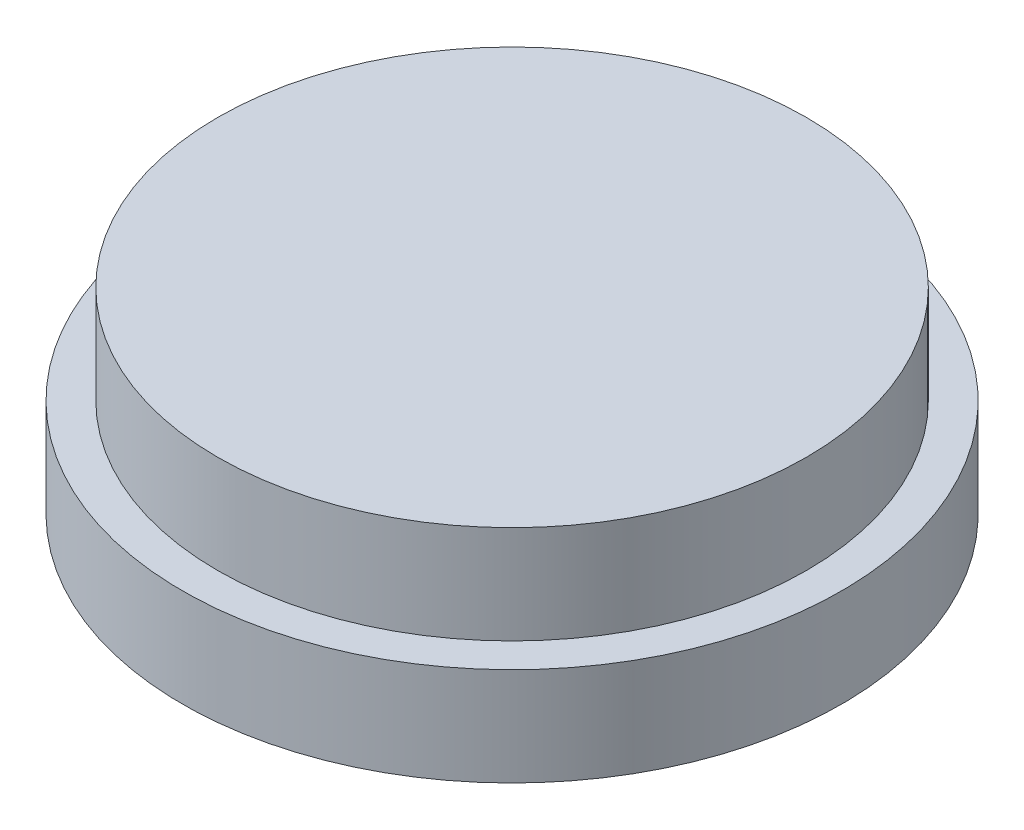
ISO-10303-21;
HEADER;
FILE_DESCRIPTION(('STEP AP214'),'2;1');
FILE_NAME('part.step','',(''),(''),'','','');
FILE_SCHEMA(('AUTOMOTIVE_DESIGN { 1 0 10303 214 1 1 1 1 }'));
ENDSEC;
DATA;
#1=APPLICATION_CONTEXT('core data for automotive mechanical design processes');
#2=APPLICATION_PROTOCOL_DEFINITION('international standard','automotive_design',2000,#1);
#3=PRODUCT_CONTEXT('',#1,'mechanical');
#4=PRODUCT('Part','Part','',(#3));
#5=PRODUCT_RELATED_PRODUCT_CATEGORY('part','',(#4));
#6=PRODUCT_DEFINITION_FORMATION('','',#4);
#7=PRODUCT_DEFINITION_CONTEXT('part definition',#1,'design');
#8=PRODUCT_DEFINITION('design','',#6,#7);
#9=PRODUCT_DEFINITION_SHAPE('','',#8);
#10=(LENGTH_UNIT() NAMED_UNIT(*) SI_UNIT(.MILLI.,.METRE.));
#11=(NAMED_UNIT(*) PLANE_ANGLE_UNIT() SI_UNIT($,.RADIAN.));
#12=(NAMED_UNIT(*) SI_UNIT($,.STERADIAN.) SOLID_ANGLE_UNIT());
#13=UNCERTAINTY_MEASURE_WITH_UNIT(LENGTH_MEASURE(1.E-05),#10,'distance_accuracy_value','');
#14=(GEOMETRIC_REPRESENTATION_CONTEXT(3) GLOBAL_UNCERTAINTY_ASSIGNED_CONTEXT((#13)) GLOBAL_UNIT_ASSIGNED_CONTEXT((#10,
#11,#12)) REPRESENTATION_CONTEXT('',''));
#15=CARTESIAN_POINT('',(0.,0.,0.));
#16=DIRECTION('',(0.,0.,1.));
#17=DIRECTION('',(1.,0.,0.));
#18=AXIS2_PLACEMENT_3D('',#15,#16,#17);
#19=CARTESIAN_POINT('',(0.,0.,-27.5));
#20=DIRECTION('',(0.,-1.,0.));
#21=DIRECTION('',(0.,0.,-1.));
#22=AXIS2_PLACEMENT_3D('',#19,#20,#21);
#23=PLANE('',#22);
#24=CARTESIAN_POINT('',(0.,0.,0.));
#25=DIRECTION('',(0.,-1.,0.));
#26=DIRECTION('',(0.,0.,-1.));
#27=AXIS2_PLACEMENT_3D('',#24,#25,#26);
#28=CIRCLE('',#27,30.);
#29=CARTESIAN_POINT('',(0.,0.,-30.));
#30=VERTEX_POINT('',#29);
#31=EDGE_CURVE('E45',#30,#30,#28,.T.);
#32=ORIENTED_EDGE('',*,*,#31,.T.);
#33=EDGE_LOOP('',(#32));
#34=FACE_BOUND('',#33,.T.);
#35=ADVANCED_FACE('F42',(#34),#23,.T.);
#36=CARTESIAN_POINT('',(0.,10.,0.));
#37=DIRECTION('',(0.,1.,0.));
#38=DIRECTION('',(0.,0.,1.));
#39=AXIS2_PLACEMENT_3D('',#36,#37,#38);
#40=PLANE('',#39);
#41=CARTESIAN_POINT('',(0.,10.,0.));
#42=DIRECTION('',(0.,1.,0.));
#43=DIRECTION('',(0.,0.,1.));
#44=AXIS2_PLACEMENT_3D('',#41,#42,#43);
#45=CIRCLE('',#44,30.);
#46=CARTESIAN_POINT('',(0.,10.,30.));
#47=VERTEX_POINT('',#46);
#48=EDGE_CURVE('E12',#47,#47,#45,.T.);
#49=ORIENTED_EDGE('',*,*,#48,.T.);
#50=EDGE_LOOP('',(#49));
#51=FACE_BOUND('',#50,.T.);
#52=ADVANCED_FACE('F57',(#51),#40,.T.);
#53=CARTESIAN_POINT('',(0.,10.,0.));
#54=DIRECTION('',(0.,-1.,0.));
#55=DIRECTION('',(0.,0.,-1.));
#56=AXIS2_PLACEMENT_3D('',#53,#54,#55);
#57=CYLINDRICAL_SURFACE('',#56,30.);
#58=ORIENTED_EDGE('',*,*,#48,.F.);
#59=EDGE_LOOP('',(#58));
#60=FACE_BOUND('',#59,.T.);
#61=ORIENTED_EDGE('',*,*,#31,.F.);
#62=EDGE_LOOP('',(#61));
#63=FACE_BOUND('',#62,.T.);
#64=ADVANCED_FACE('F55',(#60,#63),#57,.T.);
#65=CLOSED_SHELL('',(#35,#52,#64));
#66=MANIFOLD_SOLID_BREP('B2',#65);
#67=CARTESIAN_POINT('',(0.,0.,0.));
#68=DIRECTION('',(0.,-1.,0.));
#69=DIRECTION('',(0.,0.,-1.));
#70=AXIS2_PLACEMENT_3D('',#67,#68,#69);
#71=PLANE('',#70);
#72=CARTESIAN_POINT('',(0.,0.,0.));
#73=DIRECTION('',(0.,-1.,0.));
#74=DIRECTION('',(0.,0.,-1.));
#75=AXIS2_PLACEMENT_3D('',#72,#73,#74);
#76=CIRCLE('',#75,33.5885276386884);
#77=CARTESIAN_POINT('',(0.,0.,-33.5885276386884));
#78=VERTEX_POINT('',#77);
#79=EDGE_CURVE('E90',#78,#78,#76,.T.);
#80=ORIENTED_EDGE('',*,*,#79,.F.);
#81=EDGE_LOOP('',(#80));
#82=FACE_BOUND('',#81,.T.);
#83=CARTESIAN_POINT('',(0.,0.,0.));
#84=DIRECTION('',(0.,-1.,0.));
#85=DIRECTION('',(0.,0.,-1.));
#86=AXIS2_PLACEMENT_3D('',#83,#84,#85);
#87=CIRCLE('',#86,27.5);
#88=CARTESIAN_POINT('',(0.,0.,-27.5));
#89=VERTEX_POINT('',#88);
#90=EDGE_CURVE('E41',#89,#89,#87,.T.);
#91=ORIENTED_EDGE('',*,*,#90,.T.);
#92=EDGE_LOOP('',(#91));
#93=FACE_BOUND('',#92,.T.);
#94=ADVANCED_FACE('F86',(#82,#93),#71,.F.);
#95=CARTESIAN_POINT('',(0.,-10.,0.));
#96=DIRECTION('',(0.,-1.,0.));
#97=DIRECTION('',(0.,0.,-1.));
#98=AXIS2_PLACEMENT_3D('',#95,#96,#97);
#99=PLANE('',#98);
#100=CARTESIAN_POINT('',(0.,-10.,0.));
#101=DIRECTION('',(0.,-1.,0.));
#102=DIRECTION('',(0.,0.,-1.));
#103=AXIS2_PLACEMENT_3D('',#100,#101,#102);
#104=CIRCLE('',#103,33.5885276386884);
#105=CARTESIAN_POINT('',(0.,-10.,-33.5885276386884));
#106=VERTEX_POINT('',#105);
#107=EDGE_CURVE('E94',#106,#106,#104,.T.);
#108=ORIENTED_EDGE('',*,*,#107,.T.);
#109=EDGE_LOOP('',(#108));
#110=FACE_BOUND('',#109,.T.);
#111=CARTESIAN_POINT('',(0.,-10.,0.));
#112=DIRECTION('',(0.,-1.,0.));
#113=DIRECTION('',(0.,0.,-1.));
#114=AXIS2_PLACEMENT_3D('',#111,#112,#113);
#115=CIRCLE('',#114,27.5);
#116=CARTESIAN_POINT('',(0.,-10.,-27.5));
#117=VERTEX_POINT('',#116);
#118=EDGE_CURVE('E100',#117,#117,#115,.T.);
#119=ORIENTED_EDGE('',*,*,#118,.F.);
#120=EDGE_LOOP('',(#119));
#121=FACE_BOUND('',#120,.T.);
#122=ADVANCED_FACE('F109',(#110,#121),#99,.T.);
#123=CARTESIAN_POINT('',(0.,-10.,0.));
#124=DIRECTION('',(0.,1.,0.));
#125=DIRECTION('',(0.,0.,1.));
#126=AXIS2_PLACEMENT_3D('',#123,#124,#125);
#127=CYLINDRICAL_SURFACE('',#126,33.5885276386884);
#128=ORIENTED_EDGE('',*,*,#107,.F.);
#129=EDGE_LOOP('',(#128));
#130=FACE_BOUND('',#129,.T.);
#131=ORIENTED_EDGE('',*,*,#79,.T.);
#132=EDGE_LOOP('',(#131));
#133=FACE_BOUND('',#132,.T.);
#134=ADVANCED_FACE('F88',(#130,#133),#127,.T.);
#135=CARTESIAN_POINT('',(0.,-10.,0.));
#136=DIRECTION('',(0.,1.,0.));
#137=DIRECTION('',(0.,0.,1.));
#138=AXIS2_PLACEMENT_3D('',#135,#136,#137);
#139=CYLINDRICAL_SURFACE('',#138,27.5);
#140=ORIENTED_EDGE('',*,*,#118,.T.);
#141=EDGE_LOOP('',(#140));
#142=FACE_BOUND('',#141,.T.);
#143=ORIENTED_EDGE('',*,*,#90,.F.);
#144=EDGE_LOOP('',(#143));
#145=FACE_BOUND('',#144,.T.);
#146=ADVANCED_FACE('F110',(#142,#145),#139,.F.);
#147=CLOSED_SHELL('',(#94,#122,#134,#146));
#148=MANIFOLD_SOLID_BREP('B7',#147);
#149=ADVANCED_BREP_SHAPE_REPRESENTATION('',(#18,#66,#148),#14);
#150=SHAPE_DEFINITION_REPRESENTATION(#9,#149);
ENDSEC;
END-ISO-10303-21;
